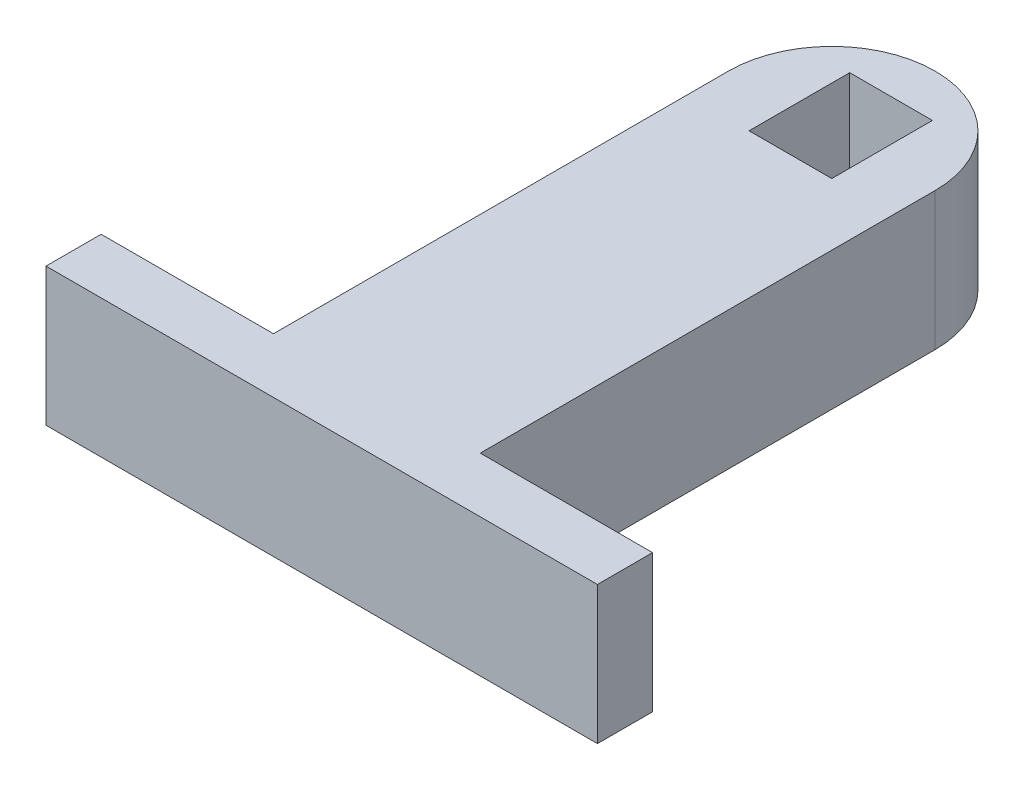
ISO-10303-21;
HEADER;
FILE_DESCRIPTION(('STEP AP214'),'2;1');
FILE_NAME('part.step','',(''),(''),'','','');
FILE_SCHEMA(('AUTOMOTIVE_DESIGN { 1 0 10303 214 1 1 1 1 }'));
ENDSEC;
DATA;
#1=APPLICATION_CONTEXT('core data for automotive mechanical design processes');
#2=APPLICATION_PROTOCOL_DEFINITION('international standard','automotive_design',2000,#1);
#3=PRODUCT_CONTEXT('',#1,'mechanical');
#4=PRODUCT('Part','Part','',(#3));
#5=PRODUCT_RELATED_PRODUCT_CATEGORY('part','',(#4));
#6=PRODUCT_DEFINITION_FORMATION('','',#4);
#7=PRODUCT_DEFINITION_CONTEXT('part definition',#1,'design');
#8=PRODUCT_DEFINITION('design','',#6,#7);
#9=PRODUCT_DEFINITION_SHAPE('','',#8);
#10=(LENGTH_UNIT() NAMED_UNIT(*) SI_UNIT(.MILLI.,.METRE.));
#11=(NAMED_UNIT(*) PLANE_ANGLE_UNIT() SI_UNIT($,.RADIAN.));
#12=(NAMED_UNIT(*) SI_UNIT($,.STERADIAN.) SOLID_ANGLE_UNIT());
#13=UNCERTAINTY_MEASURE_WITH_UNIT(LENGTH_MEASURE(1.E-05),#10,'distance_accuracy_value','');
#14=(GEOMETRIC_REPRESENTATION_CONTEXT(3) GLOBAL_UNCERTAINTY_ASSIGNED_CONTEXT((#13)) GLOBAL_UNIT_ASSIGNED_CONTEXT((#10,
#11,#12)) REPRESENTATION_CONTEXT('',''));
#15=CARTESIAN_POINT('',(0.,0.,0.));
#16=DIRECTION('',(0.,0.,1.));
#17=DIRECTION('',(1.,0.,0.));
#18=AXIS2_PLACEMENT_3D('',#15,#16,#17);
#19=CARTESIAN_POINT('',(-200.,100.,-370.));
#20=DIRECTION('',(0.,-1.,0.));
#21=DIRECTION('',(0.,0.,-1.));
#22=AXIS2_PLACEMENT_3D('',#19,#20,#21);
#23=CYLINDRICAL_SURFACE('',#22,75.);
#24=CARTESIAN_POINT('',(-200.,0.,-370.));
#25=DIRECTION('',(0.,1.,0.));
#26=DIRECTION('',(0.,0.,1.));
#27=AXIS2_PLACEMENT_3D('',#24,#25,#26);
#28=CIRCLE('',#27,75.);
#29=CARTESIAN_POINT('',(-125.,0.,-370.));
#30=VERTEX_POINT('',#29);
#31=CARTESIAN_POINT('',(-275.,0.,-370.));
#32=VERTEX_POINT('',#31);
#33=EDGE_CURVE('E161',#30,#32,#28,.T.);
#34=ORIENTED_EDGE('',*,*,#33,.T.);
#35=DIRECTION('',(0.,-1.,0.));
#36=VECTOR('',#35,1.);
#37=CARTESIAN_POINT('',(-275.,100.,-370.));
#38=LINE('',#37,#36);
#39=CARTESIAN_POINT('',(-275.,100.,-370.));
#40=VERTEX_POINT('',#39);
#41=EDGE_CURVE('E11',#40,#32,#38,.T.);
#42=ORIENTED_EDGE('',*,*,#41,.F.);
#43=CARTESIAN_POINT('',(-200.,100.,-370.));
#44=DIRECTION('',(0.,1.,0.));
#45=DIRECTION('',(0.,0.,1.));
#46=AXIS2_PLACEMENT_3D('',#43,#44,#45);
#47=CIRCLE('',#46,75.);
#48=CARTESIAN_POINT('',(-125.,100.,-370.));
#49=VERTEX_POINT('',#48);
#50=EDGE_CURVE('E162',#49,#40,#47,.T.);
#51=ORIENTED_EDGE('',*,*,#50,.F.);
#52=DIRECTION('',(0.,-1.,0.));
#53=VECTOR('',#52,1.);
#54=CARTESIAN_POINT('',(-125.,100.,-370.));
#55=LINE('',#54,#53);
#56=EDGE_CURVE('E181',#49,#30,#55,.T.);
#57=ORIENTED_EDGE('',*,*,#56,.T.);
#58=EDGE_LOOP('',(#34,#42,#51,#57));
#59=FACE_BOUND('',#58,.T.);
#60=ADVANCED_FACE('F38',(#59),#23,.T.);
#61=CARTESIAN_POINT('',(-275.,100.,0.));
#62=DIRECTION('',(1.,0.,0.));
#63=DIRECTION('',(0.,0.,-1.));
#64=AXIS2_PLACEMENT_3D('',#61,#62,#63);
#65=PLANE('',#64);
#66=DIRECTION('',(0.,0.,1.));
#67=VECTOR('',#66,1.);
#68=CARTESIAN_POINT('',(-275.,0.,0.));
#69=LINE('',#68,#67);
#70=CARTESIAN_POINT('',(-275.,0.,-40.));
#71=VERTEX_POINT('',#70);
#72=EDGE_CURVE('E184',#32,#71,#69,.T.);
#73=ORIENTED_EDGE('',*,*,#72,.T.);
#74=DIRECTION('',(0.,-1.,0.));
#75=VECTOR('',#74,1.);
#76=CARTESIAN_POINT('',(-275.,100.,-40.));
#77=LINE('',#76,#75);
#78=CARTESIAN_POINT('',(-275.,100.,-40.));
#79=VERTEX_POINT('',#78);
#80=EDGE_CURVE('E45',#79,#71,#77,.T.);
#81=ORIENTED_EDGE('',*,*,#80,.F.);
#82=DIRECTION('',(0.,0.,1.));
#83=VECTOR('',#82,1.);
#84=CARTESIAN_POINT('',(-275.,100.,0.));
#85=LINE('',#84,#83);
#86=EDGE_CURVE('E165',#40,#79,#85,.T.);
#87=ORIENTED_EDGE('',*,*,#86,.F.);
#88=ORIENTED_EDGE('',*,*,#41,.T.);
#89=EDGE_LOOP('',(#73,#81,#87,#88));
#90=FACE_BOUND('',#89,.T.);
#91=ADVANCED_FACE('F249',(#90),#65,.F.);
#92=CARTESIAN_POINT('',(0.,100.,-40.));
#93=DIRECTION('',(0.,0.,1.));
#94=DIRECTION('',(1.,0.,0.));
#95=AXIS2_PLACEMENT_3D('',#92,#93,#94);
#96=PLANE('',#95);
#97=DIRECTION('',(-1.,0.,0.));
#98=VECTOR('',#97,1.);
#99=CARTESIAN_POINT('',(0.,0.,-40.));
#100=LINE('',#99,#98);
#101=CARTESIAN_POINT('',(-400.,0.,-40.));
#102=VERTEX_POINT('',#101);
#103=EDGE_CURVE('E186',#71,#102,#100,.T.);
#104=ORIENTED_EDGE('',*,*,#103,.T.);
#105=DIRECTION('',(0.,-1.,0.));
#106=VECTOR('',#105,1.);
#107=CARTESIAN_POINT('',(-400.,100.,-40.));
#108=LINE('',#107,#106);
#109=CARTESIAN_POINT('',(-400.,100.,-40.));
#110=VERTEX_POINT('',#109);
#111=EDGE_CURVE('E211',#110,#102,#108,.T.);
#112=ORIENTED_EDGE('',*,*,#111,.F.);
#113=DIRECTION('',(-1.,0.,0.));
#114=VECTOR('',#113,1.);
#115=CARTESIAN_POINT('',(0.,100.,-40.));
#116=LINE('',#115,#114);
#117=EDGE_CURVE('E168',#79,#110,#116,.T.);
#118=ORIENTED_EDGE('',*,*,#117,.F.);
#119=ORIENTED_EDGE('',*,*,#80,.T.);
#120=EDGE_LOOP('',(#104,#112,#118,#119));
#121=FACE_BOUND('',#120,.T.);
#122=ADVANCED_FACE('F217',(#121),#96,.F.);
#123=CARTESIAN_POINT('',(-400.,100.,0.));
#124=DIRECTION('',(-1.,0.,0.));
#125=DIRECTION('',(0.,0.,1.));
#126=AXIS2_PLACEMENT_3D('',#123,#124,#125);
#127=PLANE('',#126);
#128=DIRECTION('',(0.,0.,-1.));
#129=VECTOR('',#128,1.);
#130=CARTESIAN_POINT('',(-400.,0.,0.));
#131=LINE('',#130,#129);
#132=CARTESIAN_POINT('',(-400.,0.,0.));
#133=VERTEX_POINT('',#132);
#134=EDGE_CURVE('E189',#133,#102,#131,.T.);
#135=ORIENTED_EDGE('',*,*,#134,.F.);
#136=DIRECTION('',(0.,-1.,0.));
#137=VECTOR('',#136,1.);
#138=CARTESIAN_POINT('',(-400.,100.,0.));
#139=LINE('',#138,#137);
#140=CARTESIAN_POINT('',(-400.,100.,0.));
#141=VERTEX_POINT('',#140);
#142=EDGE_CURVE('E209',#141,#133,#139,.T.);
#143=ORIENTED_EDGE('',*,*,#142,.F.);
#144=DIRECTION('',(0.,0.,-1.));
#145=VECTOR('',#144,1.);
#146=CARTESIAN_POINT('',(-400.,100.,0.));
#147=LINE('',#146,#145);
#148=EDGE_CURVE('E170',#141,#110,#147,.T.);
#149=ORIENTED_EDGE('',*,*,#148,.T.);
#150=ORIENTED_EDGE('',*,*,#111,.T.);
#151=EDGE_LOOP('',(#135,#143,#149,#150));
#152=FACE_BOUND('',#151,.T.);
#153=ADVANCED_FACE('F225',(#152),#127,.T.);
#154=CARTESIAN_POINT('',(0.,100.,0.));
#155=DIRECTION('',(0.,0.,1.));
#156=DIRECTION('',(1.,0.,0.));
#157=AXIS2_PLACEMENT_3D('',#154,#155,#156);
#158=PLANE('',#157);
#159=DIRECTION('',(-1.,0.,0.));
#160=VECTOR('',#159,1.);
#161=CARTESIAN_POINT('',(0.,0.,0.));
#162=LINE('',#161,#160);
#163=CARTESIAN_POINT('',(0.,0.,0.));
#164=VERTEX_POINT('',#163);
#165=EDGE_CURVE('E193',#164,#133,#162,.T.);
#166=ORIENTED_EDGE('',*,*,#165,.F.);
#167=DIRECTION('',(0.,-1.,0.));
#168=VECTOR('',#167,1.);
#169=CARTESIAN_POINT('',(0.,100.,0.));
#170=LINE('',#169,#168);
#171=CARTESIAN_POINT('',(0.,100.,0.));
#172=VERTEX_POINT('',#171);
#173=EDGE_CURVE('E207',#172,#164,#170,.T.);
#174=ORIENTED_EDGE('',*,*,#173,.F.);
#175=DIRECTION('',(-1.,0.,0.));
#176=VECTOR('',#175,1.);
#177=CARTESIAN_POINT('',(0.,100.,0.));
#178=LINE('',#177,#176);
#179=EDGE_CURVE('E174',#172,#141,#178,.T.);
#180=ORIENTED_EDGE('',*,*,#179,.T.);
#181=ORIENTED_EDGE('',*,*,#142,.T.);
#182=EDGE_LOOP('',(#166,#174,#180,#181));
#183=FACE_BOUND('',#182,.T.);
#184=ADVANCED_FACE('F231',(#183),#158,.T.);
#185=CARTESIAN_POINT('',(0.,100.,0.));
#186=DIRECTION('',(-1.,0.,0.));
#187=DIRECTION('',(0.,0.,1.));
#188=AXIS2_PLACEMENT_3D('',#185,#186,#187);
#189=PLANE('',#188);
#190=DIRECTION('',(0.,0.,-1.));
#191=VECTOR('',#190,1.);
#192=CARTESIAN_POINT('',(0.,0.,0.));
#193=LINE('',#192,#191);
#194=CARTESIAN_POINT('',(0.,0.,-40.));
#195=VERTEX_POINT('',#194);
#196=EDGE_CURVE('E196',#164,#195,#193,.T.);
#197=ORIENTED_EDGE('',*,*,#196,.T.);
#198=DIRECTION('',(0.,-1.,0.));
#199=VECTOR('',#198,1.);
#200=CARTESIAN_POINT('',(0.,100.,-40.));
#201=LINE('',#200,#199);
#202=CARTESIAN_POINT('',(0.,100.,-40.));
#203=VERTEX_POINT('',#202);
#204=EDGE_CURVE('E204',#203,#195,#201,.T.);
#205=ORIENTED_EDGE('',*,*,#204,.F.);
#206=DIRECTION('',(0.,0.,-1.));
#207=VECTOR('',#206,1.);
#208=CARTESIAN_POINT('',(0.,100.,0.));
#209=LINE('',#208,#207);
#210=EDGE_CURVE('E177',#172,#203,#209,.T.);
#211=ORIENTED_EDGE('',*,*,#210,.F.);
#212=ORIENTED_EDGE('',*,*,#173,.T.);
#213=EDGE_LOOP('',(#197,#205,#211,#212));
#214=FACE_BOUND('',#213,.T.);
#215=ADVANCED_FACE('F235',(#214),#189,.F.);
#216=CARTESIAN_POINT('',(-125.,0.,-40.));
#217=VERTEX_POINT('',#216);
#218=EDGE_CURVE('E190',#195,#217,#100,.T.);
#219=ORIENTED_EDGE('',*,*,#218,.T.);
#220=DIRECTION('',(0.,-1.,0.));
#221=VECTOR('',#220,1.);
#222=CARTESIAN_POINT('',(-125.,100.,-40.));
#223=LINE('',#222,#221);
#224=CARTESIAN_POINT('',(-125.,100.,-40.));
#225=VERTEX_POINT('',#224);
#226=EDGE_CURVE('E201',#225,#217,#223,.T.);
#227=ORIENTED_EDGE('',*,*,#226,.F.);
#228=EDGE_CURVE('E171',#203,#225,#116,.T.);
#229=ORIENTED_EDGE('',*,*,#228,.F.);
#230=ORIENTED_EDGE('',*,*,#204,.T.);
#231=EDGE_LOOP('',(#219,#227,#229,#230));
#232=FACE_BOUND('',#231,.T.);
#233=ADVANCED_FACE('F241',(#232),#96,.F.);
#234=CARTESIAN_POINT('',(-125.,100.,0.));
#235=DIRECTION('',(-1.,0.,0.));
#236=DIRECTION('',(0.,0.,1.));
#237=AXIS2_PLACEMENT_3D('',#234,#235,#236);
#238=PLANE('',#237);
#239=DIRECTION('',(0.,0.,-1.));
#240=VECTOR('',#239,1.);
#241=CARTESIAN_POINT('',(-125.,0.,0.));
#242=LINE('',#241,#240);
#243=EDGE_CURVE('E166',#217,#30,#242,.T.);
#244=ORIENTED_EDGE('',*,*,#243,.T.);
#245=ORIENTED_EDGE('',*,*,#56,.F.);
#246=DIRECTION('',(0.,0.,-1.));
#247=VECTOR('',#246,1.);
#248=CARTESIAN_POINT('',(-125.,100.,0.));
#249=LINE('',#248,#247);
#250=EDGE_CURVE('E179',#225,#49,#249,.T.);
#251=ORIENTED_EDGE('',*,*,#250,.F.);
#252=ORIENTED_EDGE('',*,*,#226,.T.);
#253=EDGE_LOOP('',(#244,#245,#251,#252));
#254=FACE_BOUND('',#253,.T.);
#255=ADVANCED_FACE('F245',(#254),#238,.F.);
#256=CARTESIAN_POINT('',(0.,100.,0.));
#257=DIRECTION('',(0.,1.,0.));
#258=DIRECTION('',(0.,0.,1.));
#259=AXIS2_PLACEMENT_3D('',#256,#257,#258);
#260=PLANE('',#259);
#261=DIRECTION('',(1.,0.,0.));
#262=VECTOR('',#261,1.);
#263=CARTESIAN_POINT('',(0.,100.,-340.));
#264=LINE('',#263,#262);
#265=CARTESIAN_POINT('',(-230.,100.,-340.));
#266=VERTEX_POINT('',#265);
#267=CARTESIAN_POINT('',(-170.,100.,-340.));
#268=VERTEX_POINT('',#267);
#269=EDGE_CURVE('E159',#266,#268,#264,.T.);
#270=ORIENTED_EDGE('',*,*,#269,.F.);
#271=DIRECTION('',(0.,0.,-1.));
#272=VECTOR('',#271,1.);
#273=CARTESIAN_POINT('',(-230.,100.,0.));
#274=LINE('',#273,#272);
#275=CARTESIAN_POINT('',(-230.,100.,-413.));
#276=VERTEX_POINT('',#275);
#277=EDGE_CURVE('E152',#266,#276,#274,.T.);
#278=ORIENTED_EDGE('',*,*,#277,.T.);
#279=DIRECTION('',(1.,0.,0.));
#280=VECTOR('',#279,1.);
#281=CARTESIAN_POINT('',(0.,100.,-413.));
#282=LINE('',#281,#280);
#283=CARTESIAN_POINT('',(-170.,100.,-413.));
#284=VERTEX_POINT('',#283);
#285=EDGE_CURVE('E132',#276,#284,#282,.T.);
#286=ORIENTED_EDGE('',*,*,#285,.T.);
#287=DIRECTION('',(0.,0.,-1.));
#288=VECTOR('',#287,1.);
#289=CARTESIAN_POINT('',(-170.,100.,0.));
#290=LINE('',#289,#288);
#291=EDGE_CURVE('E157',#268,#284,#290,.T.);
#292=ORIENTED_EDGE('',*,*,#291,.F.);
#293=EDGE_LOOP('',(#270,#278,#286,#292));
#294=FACE_BOUND('',#293,.T.);
#295=ORIENTED_EDGE('',*,*,#50,.T.);
#296=ORIENTED_EDGE('',*,*,#86,.T.);
#297=ORIENTED_EDGE('',*,*,#117,.T.);
#298=ORIENTED_EDGE('',*,*,#148,.F.);
#299=ORIENTED_EDGE('',*,*,#179,.F.);
#300=ORIENTED_EDGE('',*,*,#210,.T.);
#301=ORIENTED_EDGE('',*,*,#228,.T.);
#302=ORIENTED_EDGE('',*,*,#250,.T.);
#303=EDGE_LOOP('',(#295,#296,#297,#298,#299,#300,#301,#302));
#304=FACE_BOUND('',#303,.T.);
#305=ADVANCED_FACE('F229',(#294,#304),#260,.T.);
#306=CARTESIAN_POINT('',(0.,0.,0.));
#307=DIRECTION('',(0.,1.,0.));
#308=DIRECTION('',(0.,0.,1.));
#309=AXIS2_PLACEMENT_3D('',#306,#307,#308);
#310=PLANE('',#309);
#311=DIRECTION('',(0.,0.,1.));
#312=VECTOR('',#311,1.);
#313=CARTESIAN_POINT('',(-230.,0.,-413.));
#314=LINE('',#313,#312);
#315=CARTESIAN_POINT('',(-230.,0.,-413.));
#316=VERTEX_POINT('',#315);
#317=CARTESIAN_POINT('',(-230.,0.,-340.));
#318=VERTEX_POINT('',#317);
#319=EDGE_CURVE('E138',#316,#318,#314,.T.);
#320=ORIENTED_EDGE('',*,*,#319,.T.);
#321=DIRECTION('',(-1.,0.,0.));
#322=VECTOR('',#321,1.);
#323=CARTESIAN_POINT('',(-170.,0.,-340.));
#324=LINE('',#323,#322);
#325=CARTESIAN_POINT('',(-170.,0.,-340.));
#326=VERTEX_POINT('',#325);
#327=EDGE_CURVE('E60',#326,#318,#324,.T.);
#328=ORIENTED_EDGE('',*,*,#327,.F.);
#329=DIRECTION('',(0.,0.,1.));
#330=VECTOR('',#329,1.);
#331=CARTESIAN_POINT('',(-170.,0.,-413.));
#332=LINE('',#331,#330);
#333=CARTESIAN_POINT('',(-170.,0.,-413.));
#334=VERTEX_POINT('',#333);
#335=EDGE_CURVE('E145',#334,#326,#332,.T.);
#336=ORIENTED_EDGE('',*,*,#335,.F.);
#337=DIRECTION('',(-1.,0.,0.));
#338=VECTOR('',#337,1.);
#339=CARTESIAN_POINT('',(-170.,0.,-413.));
#340=LINE('',#339,#338);
#341=EDGE_CURVE('E129',#334,#316,#340,.T.);
#342=ORIENTED_EDGE('',*,*,#341,.T.);
#343=EDGE_LOOP('',(#320,#328,#336,#342));
#344=FACE_BOUND('',#343,.T.);
#345=ORIENTED_EDGE('',*,*,#33,.F.);
#346=ORIENTED_EDGE('',*,*,#243,.F.);
#347=ORIENTED_EDGE('',*,*,#218,.F.);
#348=ORIENTED_EDGE('',*,*,#196,.F.);
#349=ORIENTED_EDGE('',*,*,#165,.T.);
#350=ORIENTED_EDGE('',*,*,#134,.T.);
#351=ORIENTED_EDGE('',*,*,#103,.F.);
#352=ORIENTED_EDGE('',*,*,#72,.F.);
#353=EDGE_LOOP('',(#345,#346,#347,#348,#349,#350,#351,#352));
#354=FACE_BOUND('',#353,.T.);
#355=ADVANCED_FACE('F142',(#344,#354),#310,.F.);
#356=CARTESIAN_POINT('',(-170.,107.,-340.));
#357=DIRECTION('',(0.,0.,1.));
#358=DIRECTION('',(1.,0.,0.));
#359=AXIS2_PLACEMENT_3D('',#356,#357,#358);
#360=PLANE('',#359);
#361=ORIENTED_EDGE('',*,*,#269,.T.);
#362=DIRECTION('',(0.,-1.,0.));
#363=VECTOR('',#362,1.);
#364=CARTESIAN_POINT('',(-170.,107.,-340.));
#365=LINE('',#364,#363);
#366=EDGE_CURVE('E150',#268,#326,#365,.T.);
#367=ORIENTED_EDGE('',*,*,#366,.T.);
#368=ORIENTED_EDGE('',*,*,#327,.T.);
#369=DIRECTION('',(0.,-1.,0.));
#370=VECTOR('',#369,1.);
#371=CARTESIAN_POINT('',(-230.,107.,-340.));
#372=LINE('',#371,#370);
#373=EDGE_CURVE('E135',#266,#318,#372,.T.);
#374=ORIENTED_EDGE('',*,*,#373,.F.);
#375=EDGE_LOOP('',(#361,#367,#368,#374));
#376=FACE_BOUND('',#375,.T.);
#377=ADVANCED_FACE('F268',(#376),#360,.F.);
#378=CARTESIAN_POINT('',(-170.,107.,-413.));
#379=DIRECTION('',(1.,0.,0.));
#380=DIRECTION('',(0.,0.,-1.));
#381=AXIS2_PLACEMENT_3D('',#378,#379,#380);
#382=PLANE('',#381);
#383=ORIENTED_EDGE('',*,*,#291,.T.);
#384=DIRECTION('',(0.,-1.,0.));
#385=VECTOR('',#384,1.);
#386=CARTESIAN_POINT('',(-170.,107.,-413.));
#387=LINE('',#386,#385);
#388=EDGE_CURVE('E134',#284,#334,#387,.T.);
#389=ORIENTED_EDGE('',*,*,#388,.T.);
#390=ORIENTED_EDGE('',*,*,#335,.T.);
#391=ORIENTED_EDGE('',*,*,#366,.F.);
#392=EDGE_LOOP('',(#383,#389,#390,#391));
#393=FACE_BOUND('',#392,.T.);
#394=ADVANCED_FACE('F274',(#393),#382,.F.);
#395=CARTESIAN_POINT('',(-170.,107.,-413.));
#396=DIRECTION('',(0.,0.,1.));
#397=DIRECTION('',(1.,0.,0.));
#398=AXIS2_PLACEMENT_3D('',#395,#396,#397);
#399=PLANE('',#398);
#400=DIRECTION('',(0.,-1.,0.));
#401=VECTOR('',#400,1.);
#402=CARTESIAN_POINT('',(-230.,107.,-413.));
#403=LINE('',#402,#401);
#404=EDGE_CURVE('E52',#276,#316,#403,.T.);
#405=ORIENTED_EDGE('',*,*,#404,.T.);
#406=ORIENTED_EDGE('',*,*,#341,.F.);
#407=ORIENTED_EDGE('',*,*,#388,.F.);
#408=ORIENTED_EDGE('',*,*,#285,.F.);
#409=EDGE_LOOP('',(#405,#406,#407,#408));
#410=FACE_BOUND('',#409,.T.);
#411=ADVANCED_FACE('F126',(#410),#399,.T.);
#412=CARTESIAN_POINT('',(-230.,107.,-413.));
#413=DIRECTION('',(1.,0.,0.));
#414=DIRECTION('',(0.,0.,-1.));
#415=AXIS2_PLACEMENT_3D('',#412,#413,#414);
#416=PLANE('',#415);
#417=ORIENTED_EDGE('',*,*,#373,.T.);
#418=ORIENTED_EDGE('',*,*,#319,.F.);
#419=ORIENTED_EDGE('',*,*,#404,.F.);
#420=ORIENTED_EDGE('',*,*,#277,.F.);
#421=EDGE_LOOP('',(#417,#418,#419,#420));
#422=FACE_BOUND('',#421,.T.);
#423=ADVANCED_FACE('F139',(#422),#416,.T.);
#424=CLOSED_SHELL('',(#60,#91,#122,#153,#184,#215,#233,#255,#305,#355,#377,#394,#411,#423));
#425=MANIFOLD_SOLID_BREP('B2',#424);
#426=ADVANCED_BREP_SHAPE_REPRESENTATION('',(#18,#425),#14);
#427=SHAPE_DEFINITION_REPRESENTATION(#9,#426);
ENDSEC;
END-ISO-10303-21;
